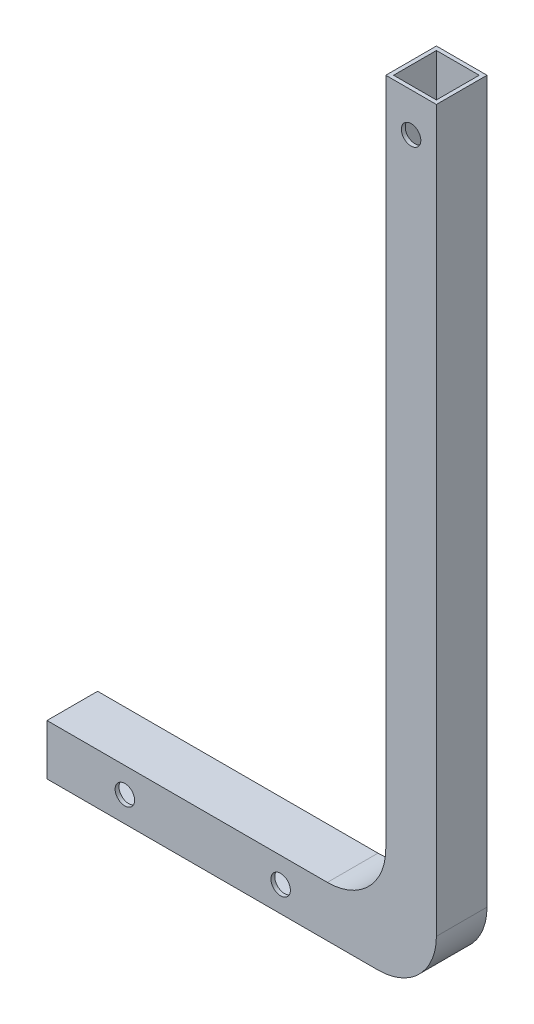
ISO-10303-21;
HEADER;
FILE_DESCRIPTION(('STEP AP214'),'2;1');
FILE_NAME('part.step','',(''),(''),'','','');
FILE_SCHEMA(('AUTOMOTIVE_DESIGN { 1 0 10303 214 1 1 1 1 }'));
ENDSEC;
DATA;
#1=APPLICATION_CONTEXT('core data for automotive mechanical design processes');
#2=APPLICATION_PROTOCOL_DEFINITION('international standard','automotive_design',2000,#1);
#3=PRODUCT_CONTEXT('',#1,'mechanical');
#4=PRODUCT('Part','Part','',(#3));
#5=PRODUCT_RELATED_PRODUCT_CATEGORY('part','',(#4));
#6=PRODUCT_DEFINITION_FORMATION('','',#4);
#7=PRODUCT_DEFINITION_CONTEXT('part definition',#1,'design');
#8=PRODUCT_DEFINITION('design','',#6,#7);
#9=PRODUCT_DEFINITION_SHAPE('','',#8);
#10=(LENGTH_UNIT() NAMED_UNIT(*) SI_UNIT(.MILLI.,.METRE.));
#11=(NAMED_UNIT(*) PLANE_ANGLE_UNIT() SI_UNIT($,.RADIAN.));
#12=(NAMED_UNIT(*) SI_UNIT($,.STERADIAN.) SOLID_ANGLE_UNIT());
#13=UNCERTAINTY_MEASURE_WITH_UNIT(LENGTH_MEASURE(1.E-05),#10,'distance_accuracy_value','');
#14=(GEOMETRIC_REPRESENTATION_CONTEXT(3) GLOBAL_UNCERTAINTY_ASSIGNED_CONTEXT((#13)) GLOBAL_UNIT_ASSIGNED_CONTEXT((#10,
#11,#12)) REPRESENTATION_CONTEXT('',''));
#15=CARTESIAN_POINT('',(0.,0.,0.));
#16=DIRECTION('',(0.,0.,1.));
#17=DIRECTION('',(1.,0.,0.));
#18=AXIS2_PLACEMENT_3D('',#15,#16,#17);
#19=CARTESIAN_POINT('',(0.,0.,33.02));
#20=DIRECTION('',(1.,0.,0.));
#21=DIRECTION('',(0.,0.,-1.));
#22=AXIS2_PLACEMENT_3D('',#19,#20,#21);
#23=PLANE('',#22);
#24=DIRECTION('',(0.,-1.,0.));
#25=VECTOR('',#24,1.);
#26=CARTESIAN_POINT('',(0.,0.,0.));
#27=LINE('',#26,#25);
#28=CARTESIAN_POINT('',(0.,0.,0.));
#29=VERTEX_POINT('',#28);
#30=CARTESIAN_POINT('',(0.,-33.02,0.));
#31=VERTEX_POINT('',#30);
#32=EDGE_CURVE('E289',#29,#31,#27,.T.);
#33=ORIENTED_EDGE('',*,*,#32,.T.);
#34=DIRECTION('',(0.,0.,-1.));
#35=VECTOR('',#34,1.);
#36=CARTESIAN_POINT('',(0.,-33.02,33.02));
#37=LINE('',#36,#35);
#38=CARTESIAN_POINT('',(0.,-33.02,33.02));
#39=VERTEX_POINT('',#38);
#40=EDGE_CURVE('E57',#39,#31,#37,.T.);
#41=ORIENTED_EDGE('',*,*,#40,.F.);
#42=DIRECTION('',(0.,-1.,0.));
#43=VECTOR('',#42,1.);
#44=CARTESIAN_POINT('',(0.,0.,33.02));
#45=LINE('',#44,#43);
#46=CARTESIAN_POINT('',(0.,0.,33.02));
#47=VERTEX_POINT('',#46);
#48=EDGE_CURVE('E263',#47,#39,#45,.T.);
#49=ORIENTED_EDGE('',*,*,#48,.F.);
#50=DIRECTION('',(0.,0.,-1.));
#51=VECTOR('',#50,1.);
#52=CARTESIAN_POINT('',(0.,0.,33.02));
#53=LINE('',#52,#51);
#54=EDGE_CURVE('E11',#47,#29,#53,.T.);
#55=ORIENTED_EDGE('',*,*,#54,.T.);
#56=EDGE_LOOP('',(#33,#41,#49,#55));
#57=FACE_BOUND('',#56,.T.);
#58=DIRECTION('',(0.,-1.,0.));
#59=VECTOR('',#58,1.);
#60=CARTESIAN_POINT('',(0.,0.,2.54));
#61=LINE('',#60,#59);
#62=CARTESIAN_POINT('',(0.,-2.54,2.54));
#63=VERTEX_POINT('',#62);
#64=CARTESIAN_POINT('',(0.,-30.48,2.54));
#65=VERTEX_POINT('',#64);
#66=EDGE_CURVE('E203',#63,#65,#61,.T.);
#67=ORIENTED_EDGE('',*,*,#66,.F.);
#68=DIRECTION('',(0.,0.,-1.));
#69=VECTOR('',#68,1.);
#70=CARTESIAN_POINT('',(0.,-2.54,33.02));
#71=LINE('',#70,#69);
#72=CARTESIAN_POINT('',(0.,-2.54,30.48));
#73=VERTEX_POINT('',#72);
#74=EDGE_CURVE('E247',#73,#63,#71,.T.);
#75=ORIENTED_EDGE('',*,*,#74,.F.);
#76=DIRECTION('',(0.,-1.,0.));
#77=VECTOR('',#76,1.);
#78=CARTESIAN_POINT('',(0.,0.,30.48));
#79=LINE('',#78,#77);
#80=CARTESIAN_POINT('',(0.,-30.48,30.48));
#81=VERTEX_POINT('',#80);
#82=EDGE_CURVE('E206',#73,#81,#79,.T.);
#83=ORIENTED_EDGE('',*,*,#82,.T.);
#84=DIRECTION('',(0.,0.,-1.));
#85=VECTOR('',#84,1.);
#86=CARTESIAN_POINT('',(0.,-30.48,33.02));
#87=LINE('',#86,#85);
#88=EDGE_CURVE('E242',#81,#65,#87,.T.);
#89=ORIENTED_EDGE('',*,*,#88,.T.);
#90=EDGE_LOOP('',(#67,#75,#83,#89));
#91=FACE_BOUND('',#90,.T.);
#92=ADVANCED_FACE('F47',(#57,#91),#23,.F.);
#93=CARTESIAN_POINT('',(182.88,0.,33.02));
#94=DIRECTION('',(0.,-1.,0.));
#95=DIRECTION('',(1.,0.,0.));
#96=AXIS2_PLACEMENT_3D('',#93,#94,#95);
#97=PLANE('',#96);
#98=DIRECTION('',(-1.,0.,0.));
#99=VECTOR('',#98,1.);
#100=CARTESIAN_POINT('',(182.88,0.,0.));
#101=LINE('',#100,#99);
#102=CARTESIAN_POINT('',(182.88,0.,0.));
#103=VERTEX_POINT('',#102);
#104=EDGE_CURVE('E250',#103,#29,#101,.T.);
#105=ORIENTED_EDGE('',*,*,#104,.T.);
#106=ORIENTED_EDGE('',*,*,#54,.F.);
#107=DIRECTION('',(-1.,0.,0.));
#108=VECTOR('',#107,1.);
#109=CARTESIAN_POINT('',(182.88,0.,33.02));
#110=LINE('',#109,#108);
#111=CARTESIAN_POINT('',(182.88,0.,33.02));
#112=VERTEX_POINT('',#111);
#113=EDGE_CURVE('E259',#112,#47,#110,.T.);
#114=ORIENTED_EDGE('',*,*,#113,.F.);
#115=DIRECTION('',(0.,0.,-1.));
#116=VECTOR('',#115,1.);
#117=CARTESIAN_POINT('',(182.88,0.,33.02));
#118=LINE('',#117,#116);
#119=EDGE_CURVE('E285',#112,#103,#118,.T.);
#120=ORIENTED_EDGE('',*,*,#119,.T.);
#121=EDGE_LOOP('',(#105,#106,#114,#120));
#122=FACE_BOUND('',#121,.T.);
#123=ADVANCED_FACE('F49',(#122),#97,.F.);
#124=CARTESIAN_POINT('',(0.,-33.02,33.02));
#125=DIRECTION('',(0.,1.,0.));
#126=DIRECTION('',(0.,0.,1.));
#127=AXIS2_PLACEMENT_3D('',#124,#125,#126);
#128=PLANE('',#127);
#129=DIRECTION('',(1.,0.,0.));
#130=VECTOR('',#129,1.);
#131=CARTESIAN_POINT('',(0.,-33.02,0.));
#132=LINE('',#131,#130);
#133=CARTESIAN_POINT('',(215.9,-33.02,0.));
#134=VERTEX_POINT('',#133);
#135=EDGE_CURVE('E292',#31,#134,#132,.T.);
#136=ORIENTED_EDGE('',*,*,#135,.T.);
#137=DIRECTION('',(0.,0.,-1.));
#138=VECTOR('',#137,1.);
#139=CARTESIAN_POINT('',(215.9,-33.02,33.02));
#140=LINE('',#139,#138);
#141=CARTESIAN_POINT('',(215.9,-33.02,33.02));
#142=VERTEX_POINT('',#141);
#143=EDGE_CURVE('E328',#142,#134,#140,.T.);
#144=ORIENTED_EDGE('',*,*,#143,.F.);
#145=DIRECTION('',(1.,0.,0.));
#146=VECTOR('',#145,1.);
#147=CARTESIAN_POINT('',(0.,-33.02,33.02));
#148=LINE('',#147,#146);
#149=EDGE_CURVE('E267',#39,#142,#148,.T.);
#150=ORIENTED_EDGE('',*,*,#149,.F.);
#151=ORIENTED_EDGE('',*,*,#40,.T.);
#152=EDGE_LOOP('',(#136,#144,#150,#151));
#153=FACE_BOUND('',#152,.T.);
#154=ADVANCED_FACE('F443',(#153),#128,.F.);
#155=CARTESIAN_POINT('',(215.9,5.07999999999999,33.02));
#156=DIRECTION('',(0.,0.,-1.));
#157=DIRECTION('',(-1.,0.,0.));
#158=AXIS2_PLACEMENT_3D('',#155,#156,#157);
#159=CYLINDRICAL_SURFACE('',#158,38.1);
#160=CARTESIAN_POINT('',(215.9,5.07999999999999,0.));
#161=DIRECTION('',(0.,0.,1.));
#162=DIRECTION('',(1.,0.,0.));
#163=AXIS2_PLACEMENT_3D('',#160,#161,#162);
#164=CIRCLE('',#163,38.1);
#165=CARTESIAN_POINT('',(254.,5.07999999999999,0.));
#166=VERTEX_POINT('',#165);
#167=EDGE_CURVE('E295',#134,#166,#164,.T.);
#168=ORIENTED_EDGE('',*,*,#167,.T.);
#169=DIRECTION('',(0.,0.,-1.));
#170=VECTOR('',#169,1.);
#171=CARTESIAN_POINT('',(254.,5.07999999999999,33.02));
#172=LINE('',#171,#170);
#173=CARTESIAN_POINT('',(254.,5.07999999999999,33.02));
#174=VERTEX_POINT('',#173);
#175=EDGE_CURVE('E324',#174,#166,#172,.T.);
#176=ORIENTED_EDGE('',*,*,#175,.F.);
#177=CARTESIAN_POINT('',(215.9,5.07999999999999,33.02));
#178=DIRECTION('',(0.,0.,1.));
#179=DIRECTION('',(1.,0.,0.));
#180=AXIS2_PLACEMENT_3D('',#177,#178,#179);
#181=CIRCLE('',#180,38.1);
#182=EDGE_CURVE('E270',#142,#174,#181,.T.);
#183=ORIENTED_EDGE('',*,*,#182,.F.);
#184=ORIENTED_EDGE('',*,*,#143,.T.);
#185=EDGE_LOOP('',(#168,#176,#183,#184));
#186=FACE_BOUND('',#185,.T.);
#187=ADVANCED_FACE('F440',(#186),#159,.T.);
#188=CARTESIAN_POINT('',(254.,5.08000000000027,33.02));
#189=DIRECTION('',(-1.,0.,0.));
#190=DIRECTION('',(0.,0.,1.));
#191=AXIS2_PLACEMENT_3D('',#188,#189,#190);
#192=PLANE('',#191);
#193=DIRECTION('',(0.,1.,0.));
#194=VECTOR('',#193,1.);
#195=CARTESIAN_POINT('',(254.,5.08000000000027,0.));
#196=LINE('',#195,#194);
#197=CARTESIAN_POINT('',(254.,474.98,0.));
#198=VERTEX_POINT('',#197);
#199=EDGE_CURVE('E298',#166,#198,#196,.T.);
#200=ORIENTED_EDGE('',*,*,#199,.T.);
#201=DIRECTION('',(0.,0.,-1.));
#202=VECTOR('',#201,1.);
#203=CARTESIAN_POINT('',(254.,474.98,33.02));
#204=LINE('',#203,#202);
#205=CARTESIAN_POINT('',(254.,474.98,33.02));
#206=VERTEX_POINT('',#205);
#207=EDGE_CURVE('E320',#206,#198,#204,.T.);
#208=ORIENTED_EDGE('',*,*,#207,.F.);
#209=DIRECTION('',(0.,1.,0.));
#210=VECTOR('',#209,1.);
#211=CARTESIAN_POINT('',(254.,5.08000000000027,33.02));
#212=LINE('',#211,#210);
#213=EDGE_CURVE('E273',#174,#206,#212,.T.);
#214=ORIENTED_EDGE('',*,*,#213,.F.);
#215=ORIENTED_EDGE('',*,*,#175,.T.);
#216=EDGE_LOOP('',(#200,#208,#214,#215));
#217=FACE_BOUND('',#216,.T.);
#218=ADVANCED_FACE('F436',(#217),#192,.F.);
#219=CARTESIAN_POINT('',(254.,474.98,33.02));
#220=DIRECTION('',(0.,-1.,0.));
#221=DIRECTION('',(0.,0.,-1.));
#222=AXIS2_PLACEMENT_3D('',#219,#220,#221);
#223=PLANE('',#222);
#224=DIRECTION('',(0.,0.,1.));
#225=VECTOR('',#224,1.);
#226=CARTESIAN_POINT('',(223.52,474.98,2.54));
#227=LINE('',#226,#225);
#228=CARTESIAN_POINT('',(223.52,474.98,2.54));
#229=VERTEX_POINT('',#228);
#230=CARTESIAN_POINT('',(223.52,474.98,30.48));
#231=VERTEX_POINT('',#230);
#232=EDGE_CURVE('E189',#229,#231,#227,.T.);
#233=ORIENTED_EDGE('',*,*,#232,.F.);
#234=DIRECTION('',(-1.,0.,0.));
#235=VECTOR('',#234,1.);
#236=CARTESIAN_POINT('',(251.46,474.980000000001,2.54));
#237=LINE('',#236,#235);
#238=CARTESIAN_POINT('',(251.46,474.980000000001,2.54));
#239=VERTEX_POINT('',#238);
#240=EDGE_CURVE('E170',#239,#229,#237,.T.);
#241=ORIENTED_EDGE('',*,*,#240,.F.);
#242=DIRECTION('',(0.,0.,-1.));
#243=VECTOR('',#242,1.);
#244=CARTESIAN_POINT('',(251.46,474.980000000001,30.48));
#245=LINE('',#244,#243);
#246=CARTESIAN_POINT('',(251.46,474.98,30.48));
#247=VERTEX_POINT('',#246);
#248=EDGE_CURVE('E179',#247,#239,#245,.T.);
#249=ORIENTED_EDGE('',*,*,#248,.F.);
#250=DIRECTION('',(1.,0.,0.));
#251=VECTOR('',#250,1.);
#252=CARTESIAN_POINT('',(223.52,474.98,30.48));
#253=LINE('',#252,#251);
#254=EDGE_CURVE('E194',#231,#247,#253,.T.);
#255=ORIENTED_EDGE('',*,*,#254,.F.);
#256=EDGE_LOOP('',(#233,#241,#249,#255));
#257=FACE_BOUND('',#256,.T.);
#258=DIRECTION('',(-1.,0.,0.));
#259=VECTOR('',#258,1.);
#260=CARTESIAN_POINT('',(254.,474.98,0.));
#261=LINE('',#260,#259);
#262=CARTESIAN_POINT('',(220.98,474.98,0.));
#263=VERTEX_POINT('',#262);
#264=EDGE_CURVE('E301',#198,#263,#261,.T.);
#265=ORIENTED_EDGE('',*,*,#264,.T.);
#266=DIRECTION('',(0.,0.,-1.));
#267=VECTOR('',#266,1.);
#268=CARTESIAN_POINT('',(220.98,474.98,33.02));
#269=LINE('',#268,#267);
#270=CARTESIAN_POINT('',(220.98,474.98,33.02));
#271=VERTEX_POINT('',#270);
#272=EDGE_CURVE('E316',#271,#263,#269,.T.);
#273=ORIENTED_EDGE('',*,*,#272,.F.);
#274=DIRECTION('',(-1.,0.,0.));
#275=VECTOR('',#274,1.);
#276=CARTESIAN_POINT('',(254.,474.98,33.02));
#277=LINE('',#276,#275);
#278=EDGE_CURVE('E276',#206,#271,#277,.T.);
#279=ORIENTED_EDGE('',*,*,#278,.F.);
#280=ORIENTED_EDGE('',*,*,#207,.T.);
#281=EDGE_LOOP('',(#265,#273,#279,#280));
#282=FACE_BOUND('',#281,.T.);
#283=ADVANCED_FACE('F186',(#257,#282),#223,.F.);
#284=CARTESIAN_POINT('',(220.98,474.98,33.02));
#285=DIRECTION('',(1.,0.,0.));
#286=DIRECTION('',(0.,0.,-1.));
#287=AXIS2_PLACEMENT_3D('',#284,#285,#286);
#288=PLANE('',#287);
#289=DIRECTION('',(0.,-1.,0.));
#290=VECTOR('',#289,1.);
#291=CARTESIAN_POINT('',(220.98,474.98,0.));
#292=LINE('',#291,#290);
#293=CARTESIAN_POINT('',(220.98,38.1000000000003,0.));
#294=VERTEX_POINT('',#293);
#295=EDGE_CURVE('E304',#263,#294,#292,.T.);
#296=ORIENTED_EDGE('',*,*,#295,.T.);
#297=DIRECTION('',(0.,0.,-1.));
#298=VECTOR('',#297,1.);
#299=CARTESIAN_POINT('',(220.98,38.1000000000003,33.02));
#300=LINE('',#299,#298);
#301=CARTESIAN_POINT('',(220.98,38.1000000000003,33.02));
#302=VERTEX_POINT('',#301);
#303=EDGE_CURVE('E312',#302,#294,#300,.T.);
#304=ORIENTED_EDGE('',*,*,#303,.F.);
#305=DIRECTION('',(0.,-1.,0.));
#306=VECTOR('',#305,1.);
#307=CARTESIAN_POINT('',(220.98,474.98,33.02));
#308=LINE('',#307,#306);
#309=EDGE_CURVE('E279',#271,#302,#308,.T.);
#310=ORIENTED_EDGE('',*,*,#309,.F.);
#311=ORIENTED_EDGE('',*,*,#272,.T.);
#312=EDGE_LOOP('',(#296,#304,#310,#311));
#313=FACE_BOUND('',#312,.T.);
#314=ADVANCED_FACE('F427',(#313),#288,.F.);
#315=CARTESIAN_POINT('',(182.88,38.1,33.02));
#316=DIRECTION('',(0.,0.,-1.));
#317=DIRECTION('',(-1.,0.,0.));
#318=AXIS2_PLACEMENT_3D('',#315,#316,#317);
#319=CYLINDRICAL_SURFACE('',#318,38.1);
#320=CARTESIAN_POINT('',(182.88,38.1,0.));
#321=DIRECTION('',(0.,0.,-1.));
#322=DIRECTION('',(-1.,0.,0.));
#323=AXIS2_PLACEMENT_3D('',#320,#321,#322);
#324=CIRCLE('',#323,38.1);
#325=EDGE_CURVE('E264',#294,#103,#324,.T.);
#326=ORIENTED_EDGE('',*,*,#325,.T.);
#327=ORIENTED_EDGE('',*,*,#119,.F.);
#328=CARTESIAN_POINT('',(182.88,38.1,33.02));
#329=DIRECTION('',(0.,0.,-1.));
#330=DIRECTION('',(-1.,0.,0.));
#331=AXIS2_PLACEMENT_3D('',#328,#329,#330);
#332=CIRCLE('',#331,38.1);
#333=EDGE_CURVE('E282',#302,#112,#332,.T.);
#334=ORIENTED_EDGE('',*,*,#333,.F.);
#335=ORIENTED_EDGE('',*,*,#303,.T.);
#336=EDGE_LOOP('',(#326,#327,#334,#335));
#337=FACE_BOUND('',#336,.T.);
#338=ADVANCED_FACE('F423',(#337),#319,.F.);
#339=CARTESIAN_POINT('',(215.9,5.07999999999999,33.02));
#340=DIRECTION('',(0.,0.,1.));
#341=DIRECTION('',(1.,0.,0.));
#342=AXIS2_PLACEMENT_3D('',#339,#340,#341);
#343=PLANE('',#342);
#344=CARTESIAN_POINT('',(237.49,449.58,33.02));
#345=DIRECTION('',(0.,0.,1.));
#346=DIRECTION('',(1.,0.,0.));
#347=AXIS2_PLACEMENT_3D('',#344,#345,#346);
#348=CIRCLE('',#347,6.34999999999999);
#349=CARTESIAN_POINT('',(243.84,449.58,33.02));
#350=VERTEX_POINT('',#349);
#351=EDGE_CURVE('E374',#350,#350,#348,.T.);
#352=ORIENTED_EDGE('',*,*,#351,.F.);
#353=EDGE_LOOP('',(#352));
#354=FACE_BOUND('',#353,.T.);
#355=CARTESIAN_POINT('',(50.8,-16.51,33.02));
#356=DIRECTION('',(0.,0.,1.));
#357=DIRECTION('',(1.,0.,0.));
#358=AXIS2_PLACEMENT_3D('',#355,#356,#357);
#359=CIRCLE('',#358,6.35000000000001);
#360=CARTESIAN_POINT('',(57.15,-16.51,33.02));
#361=VERTEX_POINT('',#360);
#362=EDGE_CURVE('E364',#361,#361,#359,.T.);
#363=ORIENTED_EDGE('',*,*,#362,.F.);
#364=EDGE_LOOP('',(#363));
#365=FACE_BOUND('',#364,.T.);
#366=CARTESIAN_POINT('',(152.4,-16.51,33.02));
#367=DIRECTION('',(0.,0.,1.));
#368=DIRECTION('',(1.,0.,0.));
#369=AXIS2_PLACEMENT_3D('',#366,#367,#368);
#370=CIRCLE('',#369,6.35);
#371=CARTESIAN_POINT('',(158.75,-16.51,33.02));
#372=VERTEX_POINT('',#371);
#373=EDGE_CURVE('E359',#372,#372,#370,.T.);
#374=ORIENTED_EDGE('',*,*,#373,.F.);
#375=EDGE_LOOP('',(#374));
#376=FACE_BOUND('',#375,.T.);
#377=ORIENTED_EDGE('',*,*,#113,.T.);
#378=ORIENTED_EDGE('',*,*,#48,.T.);
#379=ORIENTED_EDGE('',*,*,#149,.T.);
#380=ORIENTED_EDGE('',*,*,#182,.T.);
#381=ORIENTED_EDGE('',*,*,#213,.T.);
#382=ORIENTED_EDGE('',*,*,#278,.T.);
#383=ORIENTED_EDGE('',*,*,#309,.T.);
#384=ORIENTED_EDGE('',*,*,#333,.T.);
#385=EDGE_LOOP('',(#377,#378,#379,#380,#381,#382,#383,#384));
#386=FACE_BOUND('',#385,.T.);
#387=ADVANCED_FACE('F411',(#354,#365,#376,#386),#343,.T.);
#388=CARTESIAN_POINT('',(215.9,5.07999999999999,0.));
#389=DIRECTION('',(0.,0.,1.));
#390=DIRECTION('',(1.,0.,0.));
#391=AXIS2_PLACEMENT_3D('',#388,#389,#390);
#392=PLANE('',#391);
#393=CARTESIAN_POINT('',(237.49,449.58,0.));
#394=DIRECTION('',(0.,0.,1.));
#395=DIRECTION('',(1.,0.,0.));
#396=AXIS2_PLACEMENT_3D('',#393,#394,#395);
#397=CIRCLE('',#396,6.34999999999999);
#398=CARTESIAN_POINT('',(243.84,449.58,0.));
#399=VERTEX_POINT('',#398);
#400=EDGE_CURVE('E378',#399,#399,#397,.T.);
#401=ORIENTED_EDGE('',*,*,#400,.T.);
#402=EDGE_LOOP('',(#401));
#403=FACE_BOUND('',#402,.T.);
#404=CARTESIAN_POINT('',(50.8,-16.51,0.));
#405=DIRECTION('',(0.,0.,1.));
#406=DIRECTION('',(1.,0.,0.));
#407=AXIS2_PLACEMENT_3D('',#404,#405,#406);
#408=CIRCLE('',#407,6.35000000000001);
#409=CARTESIAN_POINT('',(57.15,-16.51,0.));
#410=VERTEX_POINT('',#409);
#411=EDGE_CURVE('E339',#410,#410,#408,.T.);
#412=ORIENTED_EDGE('',*,*,#411,.T.);
#413=EDGE_LOOP('',(#412));
#414=FACE_BOUND('',#413,.T.);
#415=CARTESIAN_POINT('',(152.4,-16.51,0.));
#416=DIRECTION('',(0.,0.,1.));
#417=DIRECTION('',(1.,0.,0.));
#418=AXIS2_PLACEMENT_3D('',#415,#416,#417);
#419=CIRCLE('',#418,6.35);
#420=CARTESIAN_POINT('',(158.75,-16.51,0.));
#421=VERTEX_POINT('',#420);
#422=EDGE_CURVE('E355',#421,#421,#419,.T.);
#423=ORIENTED_EDGE('',*,*,#422,.T.);
#424=EDGE_LOOP('',(#423));
#425=FACE_BOUND('',#424,.T.);
#426=ORIENTED_EDGE('',*,*,#104,.F.);
#427=ORIENTED_EDGE('',*,*,#325,.F.);
#428=ORIENTED_EDGE('',*,*,#295,.F.);
#429=ORIENTED_EDGE('',*,*,#264,.F.);
#430=ORIENTED_EDGE('',*,*,#199,.F.);
#431=ORIENTED_EDGE('',*,*,#167,.F.);
#432=ORIENTED_EDGE('',*,*,#135,.F.);
#433=ORIENTED_EDGE('',*,*,#32,.F.);
#434=EDGE_LOOP('',(#426,#427,#428,#429,#430,#431,#432,#433));
#435=FACE_BOUND('',#434,.T.);
#436=ADVANCED_FACE('F407',(#403,#414,#425,#435),#392,.F.);
#437=CARTESIAN_POINT('',(182.88,-2.54000000000001,33.02));
#438=DIRECTION('',(0.,-1.,0.));
#439=DIRECTION('',(1.,0.,0.));
#440=AXIS2_PLACEMENT_3D('',#437,#438,#439);
#441=PLANE('',#440);
#442=DIRECTION('',(-1.,0.,0.));
#443=VECTOR('',#442,1.);
#444=CARTESIAN_POINT('',(182.88,-2.54000000000001,2.54));
#445=LINE('',#444,#443);
#446=CARTESIAN_POINT('',(182.88,-2.54000000000001,2.54));
#447=VERTEX_POINT('',#446);
#448=EDGE_CURVE('E200',#447,#63,#445,.T.);
#449=ORIENTED_EDGE('',*,*,#448,.F.);
#450=DIRECTION('',(0.,0.,1.));
#451=VECTOR('',#450,1.);
#452=CARTESIAN_POINT('',(182.88,-2.54000000000001,33.02));
#453=LINE('',#452,#451);
#454=CARTESIAN_POINT('',(182.88,-2.54000000000001,30.48));
#455=VERTEX_POINT('',#454);
#456=EDGE_CURVE('E208',#455,#447,#453,.F.);
#457=ORIENTED_EDGE('',*,*,#456,.F.);
#458=DIRECTION('',(-1.,0.,0.));
#459=VECTOR('',#458,1.);
#460=CARTESIAN_POINT('',(182.88,-2.54000000000001,30.48));
#461=LINE('',#460,#459);
#462=EDGE_CURVE('E73',#455,#73,#461,.T.);
#463=ORIENTED_EDGE('',*,*,#462,.T.);
#464=ORIENTED_EDGE('',*,*,#74,.T.);
#465=EDGE_LOOP('',(#449,#457,#463,#464));
#466=FACE_BOUND('',#465,.T.);
#467=ADVANCED_FACE('F410',(#466),#441,.T.);
#468=CARTESIAN_POINT('',(0.,-30.48,33.02));
#469=DIRECTION('',(0.,1.,0.));
#470=DIRECTION('',(0.,0.,1.));
#471=AXIS2_PLACEMENT_3D('',#468,#469,#470);
#472=PLANE('',#471);
#473=DIRECTION('',(1.,0.,0.));
#474=VECTOR('',#473,1.);
#475=CARTESIAN_POINT('',(0.,-30.48,2.54));
#476=LINE('',#475,#474);
#477=CARTESIAN_POINT('',(215.9,-30.48,2.54));
#478=VERTEX_POINT('',#477);
#479=EDGE_CURVE('E235',#65,#478,#476,.T.);
#480=ORIENTED_EDGE('',*,*,#479,.F.);
#481=ORIENTED_EDGE('',*,*,#88,.F.);
#482=DIRECTION('',(1.,0.,0.));
#483=VECTOR('',#482,1.);
#484=CARTESIAN_POINT('',(0.,-30.48,30.48));
#485=LINE('',#484,#483);
#486=CARTESIAN_POINT('',(215.9,-30.48,30.48));
#487=VERTEX_POINT('',#486);
#488=EDGE_CURVE('E238',#81,#487,#485,.T.);
#489=ORIENTED_EDGE('',*,*,#488,.T.);
#490=DIRECTION('',(0.,0.,-1.));
#491=VECTOR('',#490,1.);
#492=CARTESIAN_POINT('',(215.9,-30.48,33.02));
#493=LINE('',#492,#491);
#494=EDGE_CURVE('E232',#487,#478,#493,.T.);
#495=ORIENTED_EDGE('',*,*,#494,.T.);
#496=EDGE_LOOP('',(#480,#481,#489,#495));
#497=FACE_BOUND('',#496,.T.);
#498=ADVANCED_FACE('F508',(#497),#472,.T.);
#499=CARTESIAN_POINT('',(215.9,5.07999999999999,33.02));
#500=DIRECTION('',(0.,0.,-1.));
#501=DIRECTION('',(-1.,0.,0.));
#502=AXIS2_PLACEMENT_3D('',#499,#500,#501);
#503=CYLINDRICAL_SURFACE('',#502,35.56);
#504=CARTESIAN_POINT('',(215.9,5.07999999999999,2.54));
#505=DIRECTION('',(0.,0.,1.));
#506=DIRECTION('',(1.,0.,0.));
#507=AXIS2_PLACEMENT_3D('',#504,#505,#506);
#508=CIRCLE('',#507,35.56);
#509=CARTESIAN_POINT('',(251.46,5.07999999999999,2.54));
#510=VERTEX_POINT('',#509);
#511=EDGE_CURVE('E173',#478,#510,#508,.T.);
#512=ORIENTED_EDGE('',*,*,#511,.F.);
#513=ORIENTED_EDGE('',*,*,#494,.F.);
#514=CARTESIAN_POINT('',(215.9,5.07999999999999,30.48));
#515=DIRECTION('',(0.,0.,1.));
#516=DIRECTION('',(1.,0.,0.));
#517=AXIS2_PLACEMENT_3D('',#514,#515,#516);
#518=CIRCLE('',#517,35.56);
#519=CARTESIAN_POINT('',(251.46,5.07999999999999,30.48));
#520=VERTEX_POINT('',#519);
#521=EDGE_CURVE('E229',#487,#520,#518,.T.);
#522=ORIENTED_EDGE('',*,*,#521,.T.);
#523=DIRECTION('',(0.,0.,1.));
#524=VECTOR('',#523,1.);
#525=CARTESIAN_POINT('',(251.46,5.07999999999999,33.02));
#526=LINE('',#525,#524);
#527=EDGE_CURVE('E222',#520,#510,#526,.F.);
#528=ORIENTED_EDGE('',*,*,#527,.T.);
#529=EDGE_LOOP('',(#512,#513,#522,#528));
#530=FACE_BOUND('',#529,.T.);
#531=ADVANCED_FACE('F517',(#530),#503,.F.);
#532=CARTESIAN_POINT('',(251.46,5.08000000000027,33.02));
#533=DIRECTION('',(-1.,0.,0.));
#534=DIRECTION('',(0.,0.,1.));
#535=AXIS2_PLACEMENT_3D('',#532,#533,#534);
#536=PLANE('',#535);
#537=DIRECTION('',(0.,1.,0.));
#538=VECTOR('',#537,1.);
#539=CARTESIAN_POINT('',(251.46,5.08000000000027,2.54));
#540=LINE('',#539,#538);
#541=EDGE_CURVE('E166',#510,#239,#540,.T.);
#542=ORIENTED_EDGE('',*,*,#541,.F.);
#543=ORIENTED_EDGE('',*,*,#527,.F.);
#544=DIRECTION('',(0.,1.,0.));
#545=VECTOR('',#544,1.);
#546=CARTESIAN_POINT('',(251.46,5.08000000000027,30.48));
#547=LINE('',#546,#545);
#548=EDGE_CURVE('E65',#520,#247,#547,.T.);
#549=ORIENTED_EDGE('',*,*,#548,.T.);
#550=ORIENTED_EDGE('',*,*,#248,.T.);
#551=EDGE_LOOP('',(#542,#543,#549,#550));
#552=FACE_BOUND('',#551,.T.);
#553=ADVANCED_FACE('F180',(#552),#536,.T.);
#554=CARTESIAN_POINT('',(223.52,474.98,33.02));
#555=DIRECTION('',(1.,0.,0.));
#556=DIRECTION('',(0.,0.,-1.));
#557=AXIS2_PLACEMENT_3D('',#554,#555,#556);
#558=PLANE('',#557);
#559=DIRECTION('',(0.,-1.,0.));
#560=VECTOR('',#559,1.);
#561=CARTESIAN_POINT('',(223.52,474.98,2.54));
#562=LINE('',#561,#560);
#563=CARTESIAN_POINT('',(223.52,38.1000000000003,2.54));
#564=VERTEX_POINT('',#563);
#565=EDGE_CURVE('E176',#229,#564,#562,.T.);
#566=ORIENTED_EDGE('',*,*,#565,.F.);
#567=ORIENTED_EDGE('',*,*,#232,.T.);
#568=DIRECTION('',(0.,-1.,0.));
#569=VECTOR('',#568,1.);
#570=CARTESIAN_POINT('',(223.52,474.98,30.48));
#571=LINE('',#570,#569);
#572=CARTESIAN_POINT('',(223.52,38.1000000000003,30.48));
#573=VERTEX_POINT('',#572);
#574=EDGE_CURVE('E218',#231,#573,#571,.T.);
#575=ORIENTED_EDGE('',*,*,#574,.T.);
#576=DIRECTION('',(0.,0.,-1.));
#577=VECTOR('',#576,1.);
#578=CARTESIAN_POINT('',(223.52,38.1000000000003,33.02));
#579=LINE('',#578,#577);
#580=EDGE_CURVE('E212',#573,#564,#579,.T.);
#581=ORIENTED_EDGE('',*,*,#580,.T.);
#582=EDGE_LOOP('',(#566,#567,#575,#581));
#583=FACE_BOUND('',#582,.T.);
#584=ADVANCED_FACE('F538',(#583),#558,.T.);
#585=CARTESIAN_POINT('',(182.88,38.1,33.02));
#586=DIRECTION('',(0.,0.,-1.));
#587=DIRECTION('',(-1.,0.,0.));
#588=AXIS2_PLACEMENT_3D('',#585,#586,#587);
#589=CYLINDRICAL_SURFACE('',#588,40.64);
#590=CARTESIAN_POINT('',(182.88,38.1,2.54));
#591=DIRECTION('',(0.,0.,1.));
#592=DIRECTION('',(1.,0.,0.));
#593=AXIS2_PLACEMENT_3D('',#590,#591,#592);
#594=CIRCLE('',#593,40.64);
#595=EDGE_CURVE('E207',#564,#447,#594,.F.);
#596=ORIENTED_EDGE('',*,*,#595,.F.);
#597=ORIENTED_EDGE('',*,*,#580,.F.);
#598=CARTESIAN_POINT('',(182.88,38.1,30.48));
#599=DIRECTION('',(0.,0.,1.));
#600=DIRECTION('',(1.,0.,0.));
#601=AXIS2_PLACEMENT_3D('',#598,#599,#600);
#602=CIRCLE('',#601,40.64);
#603=EDGE_CURVE('E213',#573,#455,#602,.F.);
#604=ORIENTED_EDGE('',*,*,#603,.T.);
#605=ORIENTED_EDGE('',*,*,#456,.T.);
#606=EDGE_LOOP('',(#596,#597,#604,#605));
#607=FACE_BOUND('',#606,.T.);
#608=ADVANCED_FACE('F550',(#607),#589,.T.);
#609=CARTESIAN_POINT('',(215.9,5.07999999999999,30.48));
#610=DIRECTION('',(0.,0.,1.));
#611=DIRECTION('',(1.,0.,0.));
#612=AXIS2_PLACEMENT_3D('',#609,#610,#611);
#613=PLANE('',#612);
#614=CARTESIAN_POINT('',(237.49,449.58,30.48));
#615=DIRECTION('',(0.,0.,1.));
#616=DIRECTION('',(1.,0.,0.));
#617=AXIS2_PLACEMENT_3D('',#614,#615,#616);
#618=CIRCLE('',#617,6.34999999999999);
#619=CARTESIAN_POINT('',(243.84,449.58,30.48));
#620=VERTEX_POINT('',#619);
#621=EDGE_CURVE('E360',#620,#620,#618,.T.);
#622=ORIENTED_EDGE('',*,*,#621,.T.);
#623=EDGE_LOOP('',(#622));
#624=FACE_BOUND('',#623,.T.);
#625=CARTESIAN_POINT('',(50.8,-16.51,30.48));
#626=DIRECTION('',(0.,0.,1.));
#627=DIRECTION('',(1.,0.,0.));
#628=AXIS2_PLACEMENT_3D('',#625,#626,#627);
#629=CIRCLE('',#628,6.35000000000001);
#630=CARTESIAN_POINT('',(57.15,-16.51,30.48));
#631=VERTEX_POINT('',#630);
#632=EDGE_CURVE('E184',#631,#631,#629,.T.);
#633=ORIENTED_EDGE('',*,*,#632,.T.);
#634=EDGE_LOOP('',(#633));
#635=FACE_BOUND('',#634,.T.);
#636=CARTESIAN_POINT('',(152.4,-16.51,30.48));
#637=DIRECTION('',(0.,0.,1.));
#638=DIRECTION('',(1.,0.,0.));
#639=AXIS2_PLACEMENT_3D('',#636,#637,#638);
#640=CIRCLE('',#639,6.35);
#641=CARTESIAN_POINT('',(158.75,-16.51,30.48));
#642=VERTEX_POINT('',#641);
#643=EDGE_CURVE('E338',#642,#642,#640,.T.);
#644=ORIENTED_EDGE('',*,*,#643,.T.);
#645=EDGE_LOOP('',(#644));
#646=FACE_BOUND('',#645,.T.);
#647=ORIENTED_EDGE('',*,*,#462,.F.);
#648=ORIENTED_EDGE('',*,*,#603,.F.);
#649=ORIENTED_EDGE('',*,*,#574,.F.);
#650=ORIENTED_EDGE('',*,*,#254,.T.);
#651=ORIENTED_EDGE('',*,*,#548,.F.);
#652=ORIENTED_EDGE('',*,*,#521,.F.);
#653=ORIENTED_EDGE('',*,*,#488,.F.);
#654=ORIENTED_EDGE('',*,*,#82,.F.);
#655=EDGE_LOOP('',(#647,#648,#649,#650,#651,#652,#653,#654));
#656=FACE_BOUND('',#655,.T.);
#657=ADVANCED_FACE('F395',(#624,#635,#646,#656),#613,.F.);
#658=CARTESIAN_POINT('',(215.9,5.07999999999999,2.54));
#659=DIRECTION('',(0.,0.,1.));
#660=DIRECTION('',(1.,0.,0.));
#661=AXIS2_PLACEMENT_3D('',#658,#659,#660);
#662=PLANE('',#661);
#663=CARTESIAN_POINT('',(237.49,449.58,2.54));
#664=DIRECTION('',(0.,0.,1.));
#665=DIRECTION('',(1.,0.,0.));
#666=AXIS2_PLACEMENT_3D('',#663,#664,#665);
#667=CIRCLE('',#666,6.34999999999999);
#668=CARTESIAN_POINT('',(243.84,449.58,2.54));
#669=VERTEX_POINT('',#668);
#670=EDGE_CURVE('E51',#669,#669,#667,.T.);
#671=ORIENTED_EDGE('',*,*,#670,.F.);
#672=EDGE_LOOP('',(#671));
#673=FACE_BOUND('',#672,.T.);
#674=CARTESIAN_POINT('',(50.8,-16.51,2.54));
#675=DIRECTION('',(0.,0.,1.));
#676=DIRECTION('',(1.,0.,0.));
#677=AXIS2_PLACEMENT_3D('',#674,#675,#676);
#678=CIRCLE('',#677,6.35000000000001);
#679=CARTESIAN_POINT('',(57.15,-16.51,2.54));
#680=VERTEX_POINT('',#679);
#681=EDGE_CURVE('E340',#680,#680,#678,.T.);
#682=ORIENTED_EDGE('',*,*,#681,.F.);
#683=EDGE_LOOP('',(#682));
#684=FACE_BOUND('',#683,.T.);
#685=CARTESIAN_POINT('',(152.4,-16.51,2.54));
#686=DIRECTION('',(0.,0.,1.));
#687=DIRECTION('',(1.,0.,0.));
#688=AXIS2_PLACEMENT_3D('',#685,#686,#687);
#689=CIRCLE('',#688,6.35);
#690=CARTESIAN_POINT('',(158.75,-16.51,2.54));
#691=VERTEX_POINT('',#690);
#692=EDGE_CURVE('E335',#691,#691,#689,.T.);
#693=ORIENTED_EDGE('',*,*,#692,.F.);
#694=EDGE_LOOP('',(#693));
#695=FACE_BOUND('',#694,.T.);
#696=ORIENTED_EDGE('',*,*,#448,.T.);
#697=ORIENTED_EDGE('',*,*,#66,.T.);
#698=ORIENTED_EDGE('',*,*,#479,.T.);
#699=ORIENTED_EDGE('',*,*,#511,.T.);
#700=ORIENTED_EDGE('',*,*,#541,.T.);
#701=ORIENTED_EDGE('',*,*,#240,.T.);
#702=ORIENTED_EDGE('',*,*,#565,.T.);
#703=ORIENTED_EDGE('',*,*,#595,.T.);
#704=EDGE_LOOP('',(#696,#697,#698,#699,#700,#701,#702,#703));
#705=FACE_BOUND('',#704,.T.);
#706=ADVANCED_FACE('F168',(#673,#684,#695,#705),#662,.T.);
#707=CARTESIAN_POINT('',(152.4,-16.51,0.));
#708=DIRECTION('',(0.,0.,1.));
#709=DIRECTION('',(1.,0.,0.));
#710=AXIS2_PLACEMENT_3D('',#707,#708,#709);
#711=CYLINDRICAL_SURFACE('',#710,6.35);
#712=ORIENTED_EDGE('',*,*,#692,.T.);
#713=EDGE_LOOP('',(#712));
#714=FACE_BOUND('',#713,.T.);
#715=ORIENTED_EDGE('',*,*,#422,.F.);
#716=EDGE_LOOP('',(#715));
#717=FACE_BOUND('',#716,.T.);
#718=ADVANCED_FACE('F394',(#714,#717),#711,.F.);
#719=CARTESIAN_POINT('',(50.8,-16.51,0.));
#720=DIRECTION('',(0.,0.,1.));
#721=DIRECTION('',(1.,0.,0.));
#722=AXIS2_PLACEMENT_3D('',#719,#720,#721);
#723=CYLINDRICAL_SURFACE('',#722,6.35000000000001);
#724=ORIENTED_EDGE('',*,*,#681,.T.);
#725=EDGE_LOOP('',(#724));
#726=FACE_BOUND('',#725,.T.);
#727=ORIENTED_EDGE('',*,*,#411,.F.);
#728=EDGE_LOOP('',(#727));
#729=FACE_BOUND('',#728,.T.);
#730=ADVANCED_FACE('F402',(#726,#729),#723,.F.);
#731=ORIENTED_EDGE('',*,*,#373,.T.);
#732=EDGE_LOOP('',(#731));
#733=FACE_BOUND('',#732,.T.);
#734=ORIENTED_EDGE('',*,*,#643,.F.);
#735=EDGE_LOOP('',(#734));
#736=FACE_BOUND('',#735,.T.);
#737=ADVANCED_FACE('F404',(#733,#736),#711,.F.);
#738=ORIENTED_EDGE('',*,*,#362,.T.);
#739=EDGE_LOOP('',(#738));
#740=FACE_BOUND('',#739,.T.);
#741=ORIENTED_EDGE('',*,*,#632,.F.);
#742=EDGE_LOOP('',(#741));
#743=FACE_BOUND('',#742,.T.);
#744=ADVANCED_FACE('F595',(#740,#743),#723,.F.);
#745=CARTESIAN_POINT('',(237.49,449.58,0.));
#746=DIRECTION('',(0.,0.,1.));
#747=DIRECTION('',(1.,0.,0.));
#748=AXIS2_PLACEMENT_3D('',#745,#746,#747);
#749=CYLINDRICAL_SURFACE('',#748,6.34999999999999);
#750=ORIENTED_EDGE('',*,*,#670,.T.);
#751=EDGE_LOOP('',(#750));
#752=FACE_BOUND('',#751,.T.);
#753=ORIENTED_EDGE('',*,*,#400,.F.);
#754=EDGE_LOOP('',(#753));
#755=FACE_BOUND('',#754,.T.);
#756=ADVANCED_FACE('F389',(#752,#755),#749,.F.);
#757=ORIENTED_EDGE('',*,*,#351,.T.);
#758=EDGE_LOOP('',(#757));
#759=FACE_BOUND('',#758,.T.);
#760=ORIENTED_EDGE('',*,*,#621,.F.);
#761=EDGE_LOOP('',(#760));
#762=FACE_BOUND('',#761,.T.);
#763=ADVANCED_FACE('F617',(#759,#762),#749,.F.);
#764=CLOSED_SHELL('',(#92,#123,#154,#187,#218,#283,#314,#338,#387,#436,#467,#498,#531,#553,#584,
#608,#657,#706,#718,#730,#737,#744,#756,#763));
#765=MANIFOLD_SOLID_BREP('B2',#764);
#766=ADVANCED_BREP_SHAPE_REPRESENTATION('',(#18,#765),#14);
#767=SHAPE_DEFINITION_REPRESENTATION(#9,#766);
ENDSEC;
END-ISO-10303-21;
